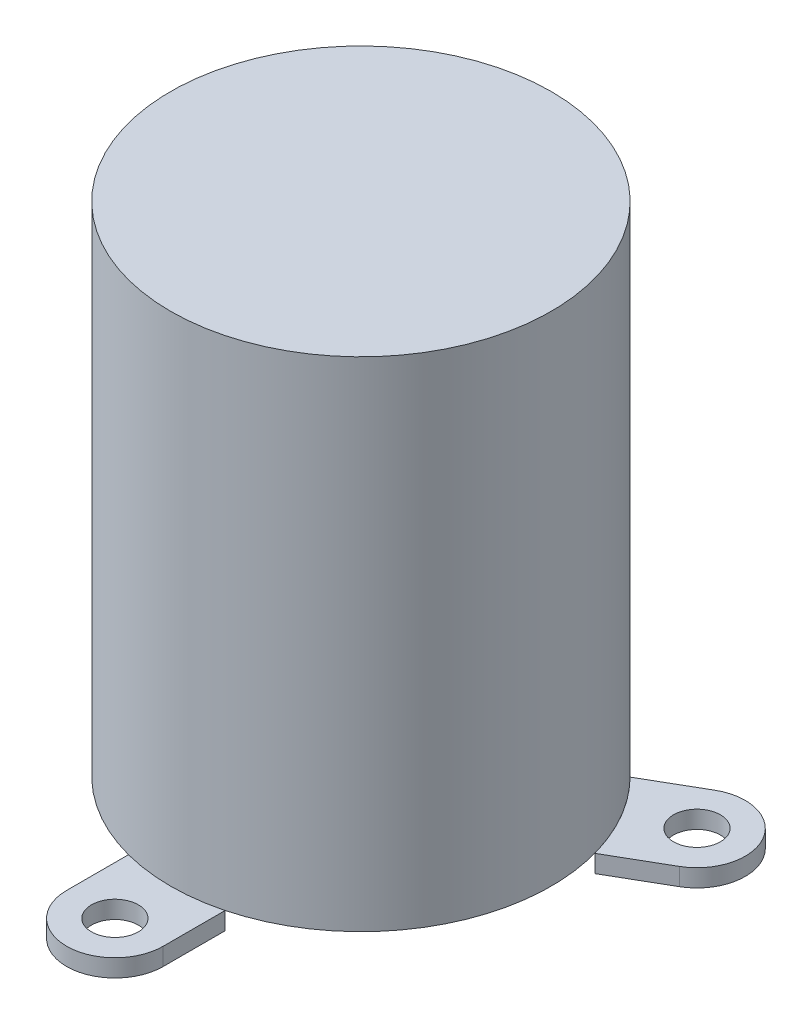
ISO-10303-21;
HEADER;
FILE_DESCRIPTION(('STEP AP214'),'2;1');
FILE_NAME('part.step','',(''),(''),'','','');
FILE_SCHEMA(('AUTOMOTIVE_DESIGN { 1 0 10303 214 1 1 1 1 }'));
ENDSEC;
DATA;
#1=APPLICATION_CONTEXT('core data for automotive mechanical design processes');
#2=APPLICATION_PROTOCOL_DEFINITION('international standard','automotive_design',2000,#1);
#3=PRODUCT_CONTEXT('',#1,'mechanical');
#4=PRODUCT('Part','Part','',(#3));
#5=PRODUCT_RELATED_PRODUCT_CATEGORY('part','',(#4));
#6=PRODUCT_DEFINITION_FORMATION('','',#4);
#7=PRODUCT_DEFINITION_CONTEXT('part definition',#1,'design');
#8=PRODUCT_DEFINITION('design','',#6,#7);
#9=PRODUCT_DEFINITION_SHAPE('','',#8);
#10=(LENGTH_UNIT() NAMED_UNIT(*) SI_UNIT(.MILLI.,.METRE.));
#11=(NAMED_UNIT(*) PLANE_ANGLE_UNIT() SI_UNIT($,.RADIAN.));
#12=(NAMED_UNIT(*) SI_UNIT($,.STERADIAN.) SOLID_ANGLE_UNIT());
#13=UNCERTAINTY_MEASURE_WITH_UNIT(LENGTH_MEASURE(1.E-05),#10,'distance_accuracy_value','');
#14=(GEOMETRIC_REPRESENTATION_CONTEXT(3) GLOBAL_UNCERTAINTY_ASSIGNED_CONTEXT((#13)) GLOBAL_UNIT_ASSIGNED_CONTEXT((#10,
#11,#12)) REPRESENTATION_CONTEXT('',''));
#15=CARTESIAN_POINT('',(0.,0.,0.));
#16=DIRECTION('',(0.,0.,1.));
#17=DIRECTION('',(1.,0.,0.));
#18=AXIS2_PLACEMENT_3D('',#15,#16,#17);
#19=CARTESIAN_POINT('',(0.,-0.6,0.));
#20=DIRECTION('',(0.,1.,0.));
#21=DIRECTION('',(0.,0.,1.));
#22=AXIS2_PLACEMENT_3D('',#19,#20,#21);
#23=PLANE('',#22);
#24=CARTESIAN_POINT('',(0.,-0.6,0.));
#25=DIRECTION('',(0.,1.,0.));
#26=DIRECTION('',(0.,0.,1.));
#27=AXIS2_PLACEMENT_3D('',#24,#25,#26);
#28=CIRCLE('',#27,6.50000000000003);
#29=CARTESIAN_POINT('',(-4.61977960986489,-0.6,-4.57248688967794));
#30=VERTEX_POINT('',#29);
#31=CARTESIAN_POINT('',(-6.26977960986486,-0.6,-1.71460305718928));
#32=VERTEX_POINT('',#31);
#33=EDGE_CURVE('E96',#30,#32,#28,.T.);
#34=ORIENTED_EDGE('',*,*,#33,.T.);
#35=DIRECTION('',(-0.866025403784437,0.,-0.500000000000002));
#36=VECTOR('',#35,1.);
#37=CARTESIAN_POINT('',(-6.26977960986486,-0.6,-1.71460305718928));
#38=LINE('',#37,#36);
#39=CARTESIAN_POINT('',(-8.09961339178922,-0.6,-2.77105808375558));
#40=VERTEX_POINT('',#39);
#41=EDGE_CURVE('E91',#32,#40,#38,.T.);
#42=ORIENTED_EDGE('',*,*,#41,.T.);
#43=CARTESIAN_POINT('',(-7.27461339178922,-0.6,-4.1999999999999));
#44=DIRECTION('',(0.,-1.,0.));
#45=DIRECTION('',(0.,0.,1.));
#46=AXIS2_PLACEMENT_3D('',#43,#44,#45);
#47=CIRCLE('',#46,1.65);
#48=CARTESIAN_POINT('',(-6.44961339178922,-0.6,-5.62894191624423));
#49=VERTEX_POINT('',#48);
#50=EDGE_CURVE('E94',#40,#49,#47,.T.);
#51=ORIENTED_EDGE('',*,*,#50,.T.);
#52=DIRECTION('',(0.866025403784437,0.,0.500000000000002));
#53=VECTOR('',#52,1.);
#54=CARTESIAN_POINT('',(-4.61977960986489,-0.6,-4.57248688967794));
#55=LINE('',#54,#53);
#56=EDGE_CURVE('E61',#49,#30,#55,.T.);
#57=ORIENTED_EDGE('',*,*,#56,.T.);
#58=EDGE_LOOP('',(#34,#42,#51,#57));
#59=FACE_BOUND('',#58,.T.);
#60=CARTESIAN_POINT('',(-7.27461339178922,-0.6,-4.1999999999999));
#61=DIRECTION('',(0.,-1.,0.));
#62=DIRECTION('',(0.,0.,-1.));
#63=AXIS2_PLACEMENT_3D('',#60,#61,#62);
#64=CIRCLE('',#63,0.800000000000002);
#65=CARTESIAN_POINT('',(-7.27461339178922,-0.6,-4.99999999999991));
#66=VERTEX_POINT('',#65);
#67=EDGE_CURVE('E111',#66,#66,#64,.T.);
#68=ORIENTED_EDGE('',*,*,#67,.F.);
#69=EDGE_LOOP('',(#68));
#70=FACE_BOUND('',#69,.T.);
#71=ADVANCED_FACE('F44',(#59,#70),#23,.F.);
#72=CARTESIAN_POINT('',(0.,0.,0.));
#73=DIRECTION('',(0.,1.,0.));
#74=DIRECTION('',(0.,0.,1.));
#75=AXIS2_PLACEMENT_3D('',#72,#73,#74);
#76=PLANE('',#75);
#77=CARTESIAN_POINT('',(0.,0.,0.));
#78=DIRECTION('',(0.,1.,0.));
#79=DIRECTION('',(0.,0.,1.));
#80=AXIS2_PLACEMENT_3D('',#77,#78,#79);
#81=CIRCLE('',#80,6.50000000000003);
#82=CARTESIAN_POINT('',(-4.61977960986489,0.,-4.57248688967794));
#83=VERTEX_POINT('',#82);
#84=CARTESIAN_POINT('',(-6.26977960986486,0.,-1.71460305718928));
#85=VERTEX_POINT('',#84);
#86=EDGE_CURVE('E108',#83,#85,#81,.T.);
#87=ORIENTED_EDGE('',*,*,#86,.F.);
#88=DIRECTION('',(0.866025403784437,0.,0.500000000000002));
#89=VECTOR('',#88,1.);
#90=CARTESIAN_POINT('',(-4.61977960986489,0.,-4.57248688967794));
#91=LINE('',#90,#89);
#92=CARTESIAN_POINT('',(-6.44961339178922,0.,-5.62894191624423));
#93=VERTEX_POINT('',#92);
#94=EDGE_CURVE('E84',#93,#83,#91,.T.);
#95=ORIENTED_EDGE('',*,*,#94,.F.);
#96=CARTESIAN_POINT('',(-7.27461339178922,0.,-4.1999999999999));
#97=DIRECTION('',(0.,-1.,0.));
#98=DIRECTION('',(0.,0.,1.));
#99=AXIS2_PLACEMENT_3D('',#96,#97,#98);
#100=CIRCLE('',#99,1.65);
#101=CARTESIAN_POINT('',(-8.09961339178922,0.,-2.77105808375558));
#102=VERTEX_POINT('',#101);
#103=EDGE_CURVE('E78',#102,#93,#100,.T.);
#104=ORIENTED_EDGE('',*,*,#103,.F.);
#105=DIRECTION('',(-0.866025403784437,0.,-0.500000000000002));
#106=VECTOR('',#105,1.);
#107=CARTESIAN_POINT('',(-6.26977960986486,0.,-1.71460305718928));
#108=LINE('',#107,#106);
#109=EDGE_CURVE('E100',#85,#102,#108,.T.);
#110=ORIENTED_EDGE('',*,*,#109,.F.);
#111=EDGE_LOOP('',(#87,#95,#104,#110));
#112=FACE_BOUND('',#111,.T.);
#113=CARTESIAN_POINT('',(-7.27461339178922,0.,-4.1999999999999));
#114=DIRECTION('',(0.,-1.,0.));
#115=DIRECTION('',(0.,0.,-1.));
#116=AXIS2_PLACEMENT_3D('',#113,#114,#115);
#117=CIRCLE('',#116,0.800000000000002);
#118=CARTESIAN_POINT('',(-7.27461339178922,0.,-4.99999999999991));
#119=VERTEX_POINT('',#118);
#120=EDGE_CURVE('E123',#119,#119,#117,.T.);
#121=ORIENTED_EDGE('',*,*,#120,.T.);
#122=EDGE_LOOP('',(#121));
#123=FACE_BOUND('',#122,.T.);
#124=ADVANCED_FACE('F119',(#112,#123),#76,.T.);
#125=CARTESIAN_POINT('',(0.,-0.6,0.));
#126=DIRECTION('',(0.,1.,0.));
#127=DIRECTION('',(0.,0.,1.));
#128=AXIS2_PLACEMENT_3D('',#125,#126,#127);
#129=CYLINDRICAL_SURFACE('',#128,6.50000000000003);
#130=ORIENTED_EDGE('',*,*,#86,.T.);
#131=DIRECTION('',(0.,1.,0.));
#132=VECTOR('',#131,1.);
#133=CARTESIAN_POINT('',(-6.26977960986486,-0.6,-1.71460305718928));
#134=LINE('',#133,#132);
#135=EDGE_CURVE('E12',#32,#85,#134,.T.);
#136=ORIENTED_EDGE('',*,*,#135,.F.);
#137=ORIENTED_EDGE('',*,*,#33,.F.);
#138=DIRECTION('',(0.,1.,0.));
#139=VECTOR('',#138,1.);
#140=CARTESIAN_POINT('',(-4.61977960986489,-0.6,-4.57248688967794));
#141=LINE('',#140,#139);
#142=EDGE_CURVE('E104',#30,#83,#141,.T.);
#143=ORIENTED_EDGE('',*,*,#142,.T.);
#144=EDGE_LOOP('',(#130,#136,#137,#143));
#145=FACE_BOUND('',#144,.T.);
#146=ADVANCED_FACE('F46',(#145),#129,.F.);
#147=CARTESIAN_POINT('',(-6.26977960986486,-0.6,-1.71460305718928));
#148=DIRECTION('',(0.500000000000002,0.,-0.866025403784437));
#149=DIRECTION('',(-0.866025403784437,0.,-0.500000000000002));
#150=AXIS2_PLACEMENT_3D('',#147,#148,#149);
#151=PLANE('',#150);
#152=ORIENTED_EDGE('',*,*,#109,.T.);
#153=DIRECTION('',(0.,1.,0.));
#154=VECTOR('',#153,1.);
#155=CARTESIAN_POINT('',(-8.09961339178922,-0.6,-2.77105808375558));
#156=LINE('',#155,#154);
#157=EDGE_CURVE('E53',#40,#102,#156,.T.);
#158=ORIENTED_EDGE('',*,*,#157,.F.);
#159=ORIENTED_EDGE('',*,*,#41,.F.);
#160=ORIENTED_EDGE('',*,*,#135,.T.);
#161=EDGE_LOOP('',(#152,#158,#159,#160));
#162=FACE_BOUND('',#161,.T.);
#163=ADVANCED_FACE('F99',(#162),#151,.F.);
#164=CARTESIAN_POINT('',(-7.27461339178922,-0.6,-4.1999999999999));
#165=DIRECTION('',(0.,1.,0.));
#166=DIRECTION('',(0.,0.,1.));
#167=AXIS2_PLACEMENT_3D('',#164,#165,#166);
#168=CYLINDRICAL_SURFACE('',#167,1.65);
#169=ORIENTED_EDGE('',*,*,#103,.T.);
#170=DIRECTION('',(0.,1.,0.));
#171=VECTOR('',#170,1.);
#172=CARTESIAN_POINT('',(-6.44961339178922,-0.6,-5.62894191624423));
#173=LINE('',#172,#171);
#174=EDGE_CURVE('E101',#49,#93,#173,.T.);
#175=ORIENTED_EDGE('',*,*,#174,.F.);
#176=ORIENTED_EDGE('',*,*,#50,.F.);
#177=ORIENTED_EDGE('',*,*,#157,.T.);
#178=EDGE_LOOP('',(#169,#175,#176,#177));
#179=FACE_BOUND('',#178,.T.);
#180=ADVANCED_FACE('F102',(#179),#168,.T.);
#181=CARTESIAN_POINT('',(-4.61977960986489,-0.6,-4.57248688967794));
#182=DIRECTION('',(-0.500000000000002,0.,0.866025403784437));
#183=DIRECTION('',(0.866025403784437,0.,0.500000000000002));
#184=AXIS2_PLACEMENT_3D('',#181,#182,#183);
#185=PLANE('',#184);
#186=ORIENTED_EDGE('',*,*,#94,.T.);
#187=ORIENTED_EDGE('',*,*,#142,.F.);
#188=ORIENTED_EDGE('',*,*,#56,.F.);
#189=ORIENTED_EDGE('',*,*,#174,.T.);
#190=EDGE_LOOP('',(#186,#187,#188,#189));
#191=FACE_BOUND('',#190,.T.);
#192=ADVANCED_FACE('F116',(#191),#185,.F.);
#193=CARTESIAN_POINT('',(-7.27461339178922,-0.6,-4.1999999999999));
#194=DIRECTION('',(0.,1.,0.));
#195=DIRECTION('',(0.,0.,1.));
#196=AXIS2_PLACEMENT_3D('',#193,#194,#195);
#197=CYLINDRICAL_SURFACE('',#196,0.800000000000002);
#198=ORIENTED_EDGE('',*,*,#67,.T.);
#199=EDGE_LOOP('',(#198));
#200=FACE_BOUND('',#199,.T.);
#201=ORIENTED_EDGE('',*,*,#120,.F.);
#202=EDGE_LOOP('',(#201));
#203=FACE_BOUND('',#202,.T.);
#204=ADVANCED_FACE('F129',(#200,#203),#197,.F.);
#205=CLOSED_SHELL('',(#71,#124,#146,#163,#180,#192,#204));
#206=MANIFOLD_SOLID_BREP('B2',#205);
#207=CARTESIAN_POINT('',(0.,-0.6,0.));
#208=DIRECTION('',(0.,1.,0.));
#209=DIRECTION('',(0.,0.,1.));
#210=AXIS2_PLACEMENT_3D('',#207,#208,#209);
#211=PLANE('',#210);
#212=CARTESIAN_POINT('',(0.,-0.6,0.));
#213=DIRECTION('',(0.,1.,0.));
#214=DIRECTION('',(0.,0.,1.));
#215=AXIS2_PLACEMENT_3D('',#212,#213,#214);
#216=CIRCLE('',#215,6.50000000000003);
#217=CARTESIAN_POINT('',(6.26977960986484,-0.6,-1.71460305718936));
#218=VERTEX_POINT('',#217);
#219=CARTESIAN_POINT('',(4.61977960986483,-0.6,-4.572486889678));
#220=VERTEX_POINT('',#219);
#221=EDGE_CURVE('E251',#218,#220,#216,.T.);
#222=ORIENTED_EDGE('',*,*,#221,.T.);
#223=DIRECTION('',(0.866025403784461,0.,-0.499999999999962));
#224=VECTOR('',#223,1.);
#225=CARTESIAN_POINT('',(4.61977960986483,-0.6,-4.572486889678));
#226=LINE('',#225,#224);
#227=CARTESIAN_POINT('',(6.44961339178923,-0.6,-5.62894191624422));
#228=VERTEX_POINT('',#227);
#229=EDGE_CURVE('E246',#220,#228,#226,.T.);
#230=ORIENTED_EDGE('',*,*,#229,.T.);
#231=CARTESIAN_POINT('',(7.27461339178923,-0.6,-4.1999999999999));
#232=DIRECTION('',(0.,-1.,0.));
#233=DIRECTION('',(0.,0.,1.));
#234=AXIS2_PLACEMENT_3D('',#231,#232,#233);
#235=CIRCLE('',#234,1.65);
#236=CARTESIAN_POINT('',(8.09961339178923,-0.6,-2.77105808375557));
#237=VERTEX_POINT('',#236);
#238=EDGE_CURVE('E249',#228,#237,#235,.T.);
#239=ORIENTED_EDGE('',*,*,#238,.T.);
#240=DIRECTION('',(-0.866025403784461,0.,0.499999999999962));
#241=VECTOR('',#240,1.);
#242=CARTESIAN_POINT('',(6.26977960986484,-0.6,-1.71460305718936));
#243=LINE('',#242,#241);
#244=EDGE_CURVE('E216',#237,#218,#243,.T.);
#245=ORIENTED_EDGE('',*,*,#244,.T.);
#246=EDGE_LOOP('',(#222,#230,#239,#245));
#247=FACE_BOUND('',#246,.T.);
#248=CARTESIAN_POINT('',(7.27461339178923,-0.6,-4.1999999999999));
#249=DIRECTION('',(0.,-1.,0.));
#250=DIRECTION('',(0.,0.,-1.));
#251=AXIS2_PLACEMENT_3D('',#248,#249,#250);
#252=CIRCLE('',#251,0.8);
#253=CARTESIAN_POINT('',(7.27461339178923,-0.6,-4.9999999999999));
#254=VERTEX_POINT('',#253);
#255=EDGE_CURVE('E266',#254,#254,#252,.T.);
#256=ORIENTED_EDGE('',*,*,#255,.F.);
#257=EDGE_LOOP('',(#256));
#258=FACE_BOUND('',#257,.T.);
#259=ADVANCED_FACE('F199',(#247,#258),#211,.F.);
#260=CARTESIAN_POINT('',(0.,0.,0.));
#261=DIRECTION('',(0.,1.,0.));
#262=DIRECTION('',(0.,0.,1.));
#263=AXIS2_PLACEMENT_3D('',#260,#261,#262);
#264=PLANE('',#263);
#265=CARTESIAN_POINT('',(0.,0.,0.));
#266=DIRECTION('',(0.,1.,0.));
#267=DIRECTION('',(0.,0.,1.));
#268=AXIS2_PLACEMENT_3D('',#265,#266,#267);
#269=CIRCLE('',#268,6.50000000000003);
#270=CARTESIAN_POINT('',(6.26977960986484,0.,-1.71460305718936));
#271=VERTEX_POINT('',#270);
#272=CARTESIAN_POINT('',(4.61977960986483,0.,-4.572486889678));
#273=VERTEX_POINT('',#272);
#274=EDGE_CURVE('E263',#271,#273,#269,.T.);
#275=ORIENTED_EDGE('',*,*,#274,.F.);
#276=DIRECTION('',(-0.866025403784461,0.,0.499999999999962));
#277=VECTOR('',#276,1.);
#278=CARTESIAN_POINT('',(6.26977960986484,0.,-1.71460305718936));
#279=LINE('',#278,#277);
#280=CARTESIAN_POINT('',(8.09961339178923,0.,-2.77105808375557));
#281=VERTEX_POINT('',#280);
#282=EDGE_CURVE('E239',#281,#271,#279,.T.);
#283=ORIENTED_EDGE('',*,*,#282,.F.);
#284=CARTESIAN_POINT('',(7.27461339178923,0.,-4.1999999999999));
#285=DIRECTION('',(0.,-1.,0.));
#286=DIRECTION('',(0.,0.,1.));
#287=AXIS2_PLACEMENT_3D('',#284,#285,#286);
#288=CIRCLE('',#287,1.65);
#289=CARTESIAN_POINT('',(6.44961339178923,0.,-5.62894191624422));
#290=VERTEX_POINT('',#289);
#291=EDGE_CURVE('E233',#290,#281,#288,.T.);
#292=ORIENTED_EDGE('',*,*,#291,.F.);
#293=DIRECTION('',(0.866025403784461,0.,-0.499999999999962));
#294=VECTOR('',#293,1.);
#295=CARTESIAN_POINT('',(4.61977960986483,0.,-4.572486889678));
#296=LINE('',#295,#294);
#297=EDGE_CURVE('E255',#273,#290,#296,.T.);
#298=ORIENTED_EDGE('',*,*,#297,.F.);
#299=EDGE_LOOP('',(#275,#283,#292,#298));
#300=FACE_BOUND('',#299,.T.);
#301=CARTESIAN_POINT('',(7.27461339178923,0.,-4.1999999999999));
#302=DIRECTION('',(0.,-1.,0.));
#303=DIRECTION('',(0.,0.,-1.));
#304=AXIS2_PLACEMENT_3D('',#301,#302,#303);
#305=CIRCLE('',#304,0.8);
#306=CARTESIAN_POINT('',(7.27461339178923,0.,-4.9999999999999));
#307=VERTEX_POINT('',#306);
#308=EDGE_CURVE('E278',#307,#307,#305,.T.);
#309=ORIENTED_EDGE('',*,*,#308,.T.);
#310=EDGE_LOOP('',(#309));
#311=FACE_BOUND('',#310,.T.);
#312=ADVANCED_FACE('F274',(#300,#311),#264,.T.);
#313=CARTESIAN_POINT('',(0.,-0.6,0.));
#314=DIRECTION('',(0.,1.,0.));
#315=DIRECTION('',(0.,0.,1.));
#316=AXIS2_PLACEMENT_3D('',#313,#314,#315);
#317=CYLINDRICAL_SURFACE('',#316,6.50000000000003);
#318=ORIENTED_EDGE('',*,*,#274,.T.);
#319=DIRECTION('',(0.,1.,0.));
#320=VECTOR('',#319,1.);
#321=CARTESIAN_POINT('',(4.61977960986483,-0.6,-4.572486889678));
#322=LINE('',#321,#320);
#323=EDGE_CURVE('E42',#220,#273,#322,.T.);
#324=ORIENTED_EDGE('',*,*,#323,.F.);
#325=ORIENTED_EDGE('',*,*,#221,.F.);
#326=DIRECTION('',(0.,1.,0.));
#327=VECTOR('',#326,1.);
#328=CARTESIAN_POINT('',(6.26977960986484,-0.6,-1.71460305718936));
#329=LINE('',#328,#327);
#330=EDGE_CURVE('E259',#218,#271,#329,.T.);
#331=ORIENTED_EDGE('',*,*,#330,.T.);
#332=EDGE_LOOP('',(#318,#324,#325,#331));
#333=FACE_BOUND('',#332,.T.);
#334=ADVANCED_FACE('F201',(#333),#317,.F.);
#335=CARTESIAN_POINT('',(4.61977960986483,-0.6,-4.572486889678));
#336=DIRECTION('',(0.499999999999962,0.,0.866025403784461));
#337=DIRECTION('',(0.866025403784461,0.,-0.499999999999962));
#338=AXIS2_PLACEMENT_3D('',#335,#336,#337);
#339=PLANE('',#338);
#340=ORIENTED_EDGE('',*,*,#297,.T.);
#341=DIRECTION('',(0.,1.,0.));
#342=VECTOR('',#341,1.);
#343=CARTESIAN_POINT('',(6.44961339178923,-0.6,-5.62894191624422));
#344=LINE('',#343,#342);
#345=EDGE_CURVE('E208',#228,#290,#344,.T.);
#346=ORIENTED_EDGE('',*,*,#345,.F.);
#347=ORIENTED_EDGE('',*,*,#229,.F.);
#348=ORIENTED_EDGE('',*,*,#323,.T.);
#349=EDGE_LOOP('',(#340,#346,#347,#348));
#350=FACE_BOUND('',#349,.T.);
#351=ADVANCED_FACE('F254',(#350),#339,.F.);
#352=CARTESIAN_POINT('',(7.27461339178923,-0.6,-4.1999999999999));
#353=DIRECTION('',(0.,1.,0.));
#354=DIRECTION('',(0.,0.,1.));
#355=AXIS2_PLACEMENT_3D('',#352,#353,#354);
#356=CYLINDRICAL_SURFACE('',#355,1.65);
#357=ORIENTED_EDGE('',*,*,#291,.T.);
#358=DIRECTION('',(0.,1.,0.));
#359=VECTOR('',#358,1.);
#360=CARTESIAN_POINT('',(8.09961339178923,-0.6,-2.77105808375557));
#361=LINE('',#360,#359);
#362=EDGE_CURVE('E256',#237,#281,#361,.T.);
#363=ORIENTED_EDGE('',*,*,#362,.F.);
#364=ORIENTED_EDGE('',*,*,#238,.F.);
#365=ORIENTED_EDGE('',*,*,#345,.T.);
#366=EDGE_LOOP('',(#357,#363,#364,#365));
#367=FACE_BOUND('',#366,.T.);
#368=ADVANCED_FACE('F257',(#367),#356,.T.);
#369=CARTESIAN_POINT('',(6.26977960986484,-0.6,-1.71460305718936));
#370=DIRECTION('',(-0.499999999999962,0.,-0.86602540378446));
#371=DIRECTION('',(-0.866025403784461,0.,0.499999999999962));
#372=AXIS2_PLACEMENT_3D('',#369,#370,#371);
#373=PLANE('',#372);
#374=ORIENTED_EDGE('',*,*,#282,.T.);
#375=ORIENTED_EDGE('',*,*,#330,.F.);
#376=ORIENTED_EDGE('',*,*,#244,.F.);
#377=ORIENTED_EDGE('',*,*,#362,.T.);
#378=EDGE_LOOP('',(#374,#375,#376,#377));
#379=FACE_BOUND('',#378,.T.);
#380=ADVANCED_FACE('F271',(#379),#373,.F.);
#381=CARTESIAN_POINT('',(7.27461339178923,-0.6,-4.1999999999999));
#382=DIRECTION('',(0.,1.,0.));
#383=DIRECTION('',(0.,0.,1.));
#384=AXIS2_PLACEMENT_3D('',#381,#382,#383);
#385=CYLINDRICAL_SURFACE('',#384,0.8);
#386=ORIENTED_EDGE('',*,*,#255,.T.);
#387=EDGE_LOOP('',(#386));
#388=FACE_BOUND('',#387,.T.);
#389=ORIENTED_EDGE('',*,*,#308,.F.);
#390=EDGE_LOOP('',(#389));
#391=FACE_BOUND('',#390,.T.);
#392=ADVANCED_FACE('F284',(#388,#391),#385,.F.);
#393=CLOSED_SHELL('',(#259,#312,#334,#351,#368,#380,#392));
#394=MANIFOLD_SOLID_BREP('B6',#393);
#395=CARTESIAN_POINT('',(0.,-0.6,0.));
#396=DIRECTION('',(0.,1.,0.));
#397=DIRECTION('',(0.,0.,1.));
#398=AXIS2_PLACEMENT_3D('',#395,#396,#397);
#399=PLANE('',#398);
#400=CARTESIAN_POINT('',(0.,-0.6,0.));
#401=DIRECTION('',(0.,1.,0.));
#402=DIRECTION('',(0.,0.,1.));
#403=AXIS2_PLACEMENT_3D('',#400,#401,#402);
#404=CIRCLE('',#403,6.49999999999994);
#405=CARTESIAN_POINT('',(-1.65,-0.6,6.28708994686731));
#406=VERTEX_POINT('',#405);
#407=CARTESIAN_POINT('',(1.65,-0.6,6.28708994686731));
#408=VERTEX_POINT('',#407);
#409=EDGE_CURVE('E403',#406,#408,#404,.T.);
#410=ORIENTED_EDGE('',*,*,#409,.T.);
#411=DIRECTION('',(0.,0.,1.));
#412=VECTOR('',#411,1.);
#413=CARTESIAN_POINT('',(1.65,-0.6,6.28708994686731));
#414=LINE('',#413,#412);
#415=CARTESIAN_POINT('',(1.65,-0.6,8.4));
#416=VERTEX_POINT('',#415);
#417=EDGE_CURVE('E398',#408,#416,#414,.T.);
#418=ORIENTED_EDGE('',*,*,#417,.T.);
#419=CARTESIAN_POINT('',(0.,-0.6,8.4));
#420=DIRECTION('',(0.,-1.,0.));
#421=DIRECTION('',(0.,0.,1.));
#422=AXIS2_PLACEMENT_3D('',#419,#420,#421);
#423=CIRCLE('',#422,1.65);
#424=CARTESIAN_POINT('',(-1.65,-0.6,8.4));
#425=VERTEX_POINT('',#424);
#426=EDGE_CURVE('E401',#416,#425,#423,.T.);
#427=ORIENTED_EDGE('',*,*,#426,.T.);
#428=DIRECTION('',(0.,0.,-1.));
#429=VECTOR('',#428,1.);
#430=CARTESIAN_POINT('',(-1.65,-0.6,6.28708994686731));
#431=LINE('',#430,#429);
#432=EDGE_CURVE('E368',#425,#406,#431,.T.);
#433=ORIENTED_EDGE('',*,*,#432,.T.);
#434=EDGE_LOOP('',(#410,#418,#427,#433));
#435=FACE_BOUND('',#434,.T.);
#436=CARTESIAN_POINT('',(0.,-0.6,8.4));
#437=DIRECTION('',(0.,-1.,0.));
#438=DIRECTION('',(0.,0.,-1.));
#439=AXIS2_PLACEMENT_3D('',#436,#437,#438);
#440=CIRCLE('',#439,0.8);
#441=CARTESIAN_POINT('',(0.,-0.6,7.6));
#442=VERTEX_POINT('',#441);
#443=EDGE_CURVE('E418',#442,#442,#440,.T.);
#444=ORIENTED_EDGE('',*,*,#443,.F.);
#445=EDGE_LOOP('',(#444));
#446=FACE_BOUND('',#445,.T.);
#447=ADVANCED_FACE('F351',(#435,#446),#399,.F.);
#448=CARTESIAN_POINT('',(0.,0.,0.));
#449=DIRECTION('',(0.,1.,0.));
#450=DIRECTION('',(0.,0.,1.));
#451=AXIS2_PLACEMENT_3D('',#448,#449,#450);
#452=PLANE('',#451);
#453=CARTESIAN_POINT('',(0.,0.,0.));
#454=DIRECTION('',(0.,1.,0.));
#455=DIRECTION('',(0.,0.,1.));
#456=AXIS2_PLACEMENT_3D('',#453,#454,#455);
#457=CIRCLE('',#456,6.49999999999994);
#458=CARTESIAN_POINT('',(-1.65,0.,6.28708994686731));
#459=VERTEX_POINT('',#458);
#460=CARTESIAN_POINT('',(1.65,0.,6.28708994686731));
#461=VERTEX_POINT('',#460);
#462=EDGE_CURVE('E415',#459,#461,#457,.T.);
#463=ORIENTED_EDGE('',*,*,#462,.F.);
#464=DIRECTION('',(0.,0.,-1.));
#465=VECTOR('',#464,1.);
#466=CARTESIAN_POINT('',(-1.65,0.,6.28708994686731));
#467=LINE('',#466,#465);
#468=CARTESIAN_POINT('',(-1.65,0.,8.4));
#469=VERTEX_POINT('',#468);
#470=EDGE_CURVE('E391',#469,#459,#467,.T.);
#471=ORIENTED_EDGE('',*,*,#470,.F.);
#472=CARTESIAN_POINT('',(0.,0.,8.4));
#473=DIRECTION('',(0.,-1.,0.));
#474=DIRECTION('',(0.,0.,1.));
#475=AXIS2_PLACEMENT_3D('',#472,#473,#474);
#476=CIRCLE('',#475,1.65);
#477=CARTESIAN_POINT('',(1.65,0.,8.4));
#478=VERTEX_POINT('',#477);
#479=EDGE_CURVE('E385',#478,#469,#476,.T.);
#480=ORIENTED_EDGE('',*,*,#479,.F.);
#481=DIRECTION('',(0.,0.,1.));
#482=VECTOR('',#481,1.);
#483=CARTESIAN_POINT('',(1.65,0.,6.28708994686731));
#484=LINE('',#483,#482);
#485=EDGE_CURVE('E407',#461,#478,#484,.T.);
#486=ORIENTED_EDGE('',*,*,#485,.F.);
#487=EDGE_LOOP('',(#463,#471,#480,#486));
#488=FACE_BOUND('',#487,.T.);
#489=CARTESIAN_POINT('',(0.,0.,8.4));
#490=DIRECTION('',(0.,-1.,0.));
#491=DIRECTION('',(0.,0.,-1.));
#492=AXIS2_PLACEMENT_3D('',#489,#490,#491);
#493=CIRCLE('',#492,0.8);
#494=CARTESIAN_POINT('',(0.,0.,7.6));
#495=VERTEX_POINT('',#494);
#496=EDGE_CURVE('E430',#495,#495,#493,.T.);
#497=ORIENTED_EDGE('',*,*,#496,.T.);
#498=EDGE_LOOP('',(#497));
#499=FACE_BOUND('',#498,.T.);
#500=ADVANCED_FACE('F426',(#488,#499),#452,.T.);
#501=CARTESIAN_POINT('',(0.,-0.6,0.));
#502=DIRECTION('',(0.,1.,0.));
#503=DIRECTION('',(0.,0.,1.));
#504=AXIS2_PLACEMENT_3D('',#501,#502,#503);
#505=CYLINDRICAL_SURFACE('',#504,6.49999999999994);
#506=ORIENTED_EDGE('',*,*,#462,.T.);
#507=DIRECTION('',(0.,1.,0.));
#508=VECTOR('',#507,1.);
#509=CARTESIAN_POINT('',(1.65,-0.6,6.28708994686731));
#510=LINE('',#509,#508);
#511=EDGE_CURVE('E197',#408,#461,#510,.T.);
#512=ORIENTED_EDGE('',*,*,#511,.F.);
#513=ORIENTED_EDGE('',*,*,#409,.F.);
#514=DIRECTION('',(0.,1.,0.));
#515=VECTOR('',#514,1.);
#516=CARTESIAN_POINT('',(-1.65,-0.6,6.28708994686731));
#517=LINE('',#516,#515);
#518=EDGE_CURVE('E411',#406,#459,#517,.T.);
#519=ORIENTED_EDGE('',*,*,#518,.T.);
#520=EDGE_LOOP('',(#506,#512,#513,#519));
#521=FACE_BOUND('',#520,.T.);
#522=ADVANCED_FACE('F353',(#521),#505,.F.);
#523=CARTESIAN_POINT('',(1.65,-0.6,6.28708994686731));
#524=DIRECTION('',(-1.,0.,0.));
#525=DIRECTION('',(0.,0.,1.));
#526=AXIS2_PLACEMENT_3D('',#523,#524,#525);
#527=PLANE('',#526);
#528=ORIENTED_EDGE('',*,*,#485,.T.);
#529=DIRECTION('',(0.,1.,0.));
#530=VECTOR('',#529,1.);
#531=CARTESIAN_POINT('',(1.65,-0.6,8.4));
#532=LINE('',#531,#530);
#533=EDGE_CURVE('E360',#416,#478,#532,.T.);
#534=ORIENTED_EDGE('',*,*,#533,.F.);
#535=ORIENTED_EDGE('',*,*,#417,.F.);
#536=ORIENTED_EDGE('',*,*,#511,.T.);
#537=EDGE_LOOP('',(#528,#534,#535,#536));
#538=FACE_BOUND('',#537,.T.);
#539=ADVANCED_FACE('F406',(#538),#527,.F.);
#540=CARTESIAN_POINT('',(0.,-0.6,8.4));
#541=DIRECTION('',(0.,1.,0.));
#542=DIRECTION('',(0.,0.,1.));
#543=AXIS2_PLACEMENT_3D('',#540,#541,#542);
#544=CYLINDRICAL_SURFACE('',#543,1.65);
#545=ORIENTED_EDGE('',*,*,#479,.T.);
#546=DIRECTION('',(0.,1.,0.));
#547=VECTOR('',#546,1.);
#548=CARTESIAN_POINT('',(-1.65,-0.6,8.4));
#549=LINE('',#548,#547);
#550=EDGE_CURVE('E408',#425,#469,#549,.T.);
#551=ORIENTED_EDGE('',*,*,#550,.F.);
#552=ORIENTED_EDGE('',*,*,#426,.F.);
#553=ORIENTED_EDGE('',*,*,#533,.T.);
#554=EDGE_LOOP('',(#545,#551,#552,#553));
#555=FACE_BOUND('',#554,.T.);
#556=ADVANCED_FACE('F409',(#555),#544,.T.);
#557=CARTESIAN_POINT('',(-1.65,-0.6,6.28708994686731));
#558=DIRECTION('',(1.,0.,0.));
#559=DIRECTION('',(0.,0.,-1.));
#560=AXIS2_PLACEMENT_3D('',#557,#558,#559);
#561=PLANE('',#560);
#562=ORIENTED_EDGE('',*,*,#470,.T.);
#563=ORIENTED_EDGE('',*,*,#518,.F.);
#564=ORIENTED_EDGE('',*,*,#432,.F.);
#565=ORIENTED_EDGE('',*,*,#550,.T.);
#566=EDGE_LOOP('',(#562,#563,#564,#565));
#567=FACE_BOUND('',#566,.T.);
#568=ADVANCED_FACE('F423',(#567),#561,.F.);
#569=CARTESIAN_POINT('',(0.,-0.6,8.4));
#570=DIRECTION('',(0.,1.,0.));
#571=DIRECTION('',(0.,0.,1.));
#572=AXIS2_PLACEMENT_3D('',#569,#570,#571);
#573=CYLINDRICAL_SURFACE('',#572,0.8);
#574=ORIENTED_EDGE('',*,*,#443,.T.);
#575=EDGE_LOOP('',(#574));
#576=FACE_BOUND('',#575,.T.);
#577=ORIENTED_EDGE('',*,*,#496,.F.);
#578=EDGE_LOOP('',(#577));
#579=FACE_BOUND('',#578,.T.);
#580=ADVANCED_FACE('F436',(#576,#579),#573,.F.);
#581=CLOSED_SHELL('',(#447,#500,#522,#539,#556,#568,#580));
#582=MANIFOLD_SOLID_BREP('B36',#581);
#583=CARTESIAN_POINT('',(0.,17.,0.));
#584=DIRECTION('',(0.,-1.,0.));
#585=DIRECTION('',(0.,0.,-1.));
#586=AXIS2_PLACEMENT_3D('',#583,#584,#585);
#587=CYLINDRICAL_SURFACE('',#586,6.5);
#588=CARTESIAN_POINT('',(0.,17.,0.));
#589=DIRECTION('',(0.,1.,0.));
#590=DIRECTION('',(0.,0.,1.));
#591=AXIS2_PLACEMENT_3D('',#588,#589,#590);
#592=CIRCLE('',#591,6.5);
#593=CARTESIAN_POINT('',(0.,17.,6.5));
#594=VERTEX_POINT('',#593);
#595=EDGE_CURVE('E350',#594,#594,#592,.T.);
#596=ORIENTED_EDGE('',*,*,#595,.F.);
#597=EDGE_LOOP('',(#596));
#598=FACE_BOUND('',#597,.T.);
#599=CARTESIAN_POINT('',(0.,0.,0.));
#600=DIRECTION('',(0.,1.,0.));
#601=DIRECTION('',(0.,0.,1.));
#602=AXIS2_PLACEMENT_3D('',#599,#600,#601);
#603=CIRCLE('',#602,6.5);
#604=CARTESIAN_POINT('',(0.,0.,6.5));
#605=VERTEX_POINT('',#604);
#606=EDGE_CURVE('E499',#605,#605,#603,.T.);
#607=ORIENTED_EDGE('',*,*,#606,.T.);
#608=EDGE_LOOP('',(#607));
#609=FACE_BOUND('',#608,.T.);
#610=ADVANCED_FACE('F496',(#598,#609),#587,.T.);
#611=CARTESIAN_POINT('',(0.,17.,0.));
#612=DIRECTION('',(0.,1.,0.));
#613=DIRECTION('',(0.,0.,1.));
#614=AXIS2_PLACEMENT_3D('',#611,#612,#613);
#615=PLANE('',#614);
#616=ORIENTED_EDGE('',*,*,#595,.T.);
#617=EDGE_LOOP('',(#616));
#618=FACE_BOUND('',#617,.T.);
#619=ADVANCED_FACE('F511',(#618),#615,.T.);
#620=CARTESIAN_POINT('',(0.,0.,0.));
#621=DIRECTION('',(0.,1.,0.));
#622=DIRECTION('',(0.,0.,1.));
#623=AXIS2_PLACEMENT_3D('',#620,#621,#622);
#624=PLANE('',#623);
#625=ORIENTED_EDGE('',*,*,#606,.F.);
#626=EDGE_LOOP('',(#625));
#627=FACE_BOUND('',#626,.T.);
#628=ADVANCED_FACE('F509',(#627),#624,.F.);
#629=CLOSED_SHELL('',(#610,#619,#628));
#630=MANIFOLD_SOLID_BREP('B191',#629);
#631=ADVANCED_BREP_SHAPE_REPRESENTATION('',(#18,#206,#394,#582,#630),#14);
#632=SHAPE_DEFINITION_REPRESENTATION(#9,#631);
ENDSEC;
END-ISO-10303-21;
